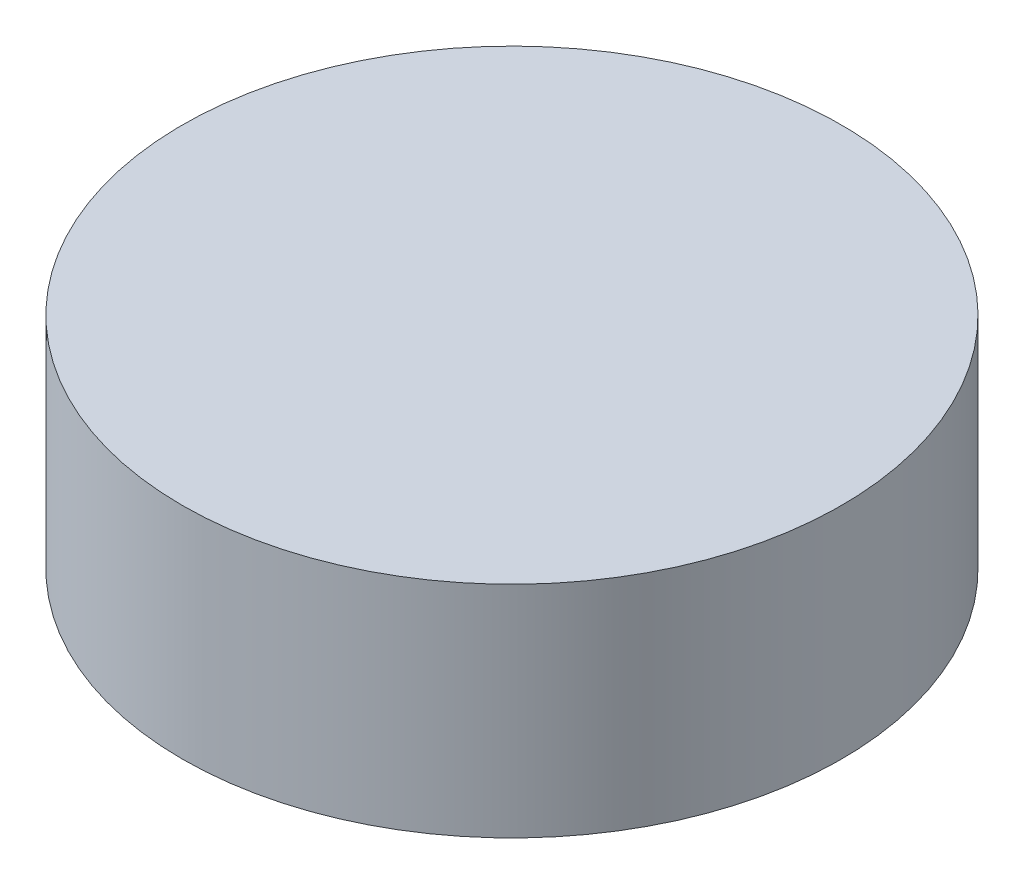
ISO-10303-21;
HEADER;
FILE_DESCRIPTION(('STEP AP214'),'2;1');
FILE_NAME('part.step','',(''),(''),'','','');
FILE_SCHEMA(('AUTOMOTIVE_DESIGN { 1 0 10303 214 1 1 1 1 }'));
ENDSEC;
DATA;
#1=APPLICATION_CONTEXT('core data for automotive mechanical design processes');
#2=APPLICATION_PROTOCOL_DEFINITION('international standard','automotive_design',2000,#1);
#3=PRODUCT_CONTEXT('',#1,'mechanical');
#4=PRODUCT('Part','Part','',(#3));
#5=PRODUCT_RELATED_PRODUCT_CATEGORY('part','',(#4));
#6=PRODUCT_DEFINITION_FORMATION('','',#4);
#7=PRODUCT_DEFINITION_CONTEXT('part definition',#1,'design');
#8=PRODUCT_DEFINITION('design','',#6,#7);
#9=PRODUCT_DEFINITION_SHAPE('','',#8);
#10=(LENGTH_UNIT() NAMED_UNIT(*) SI_UNIT(.MILLI.,.METRE.));
#11=(NAMED_UNIT(*) PLANE_ANGLE_UNIT() SI_UNIT($,.RADIAN.));
#12=(NAMED_UNIT(*) SI_UNIT($,.STERADIAN.) SOLID_ANGLE_UNIT());
#13=UNCERTAINTY_MEASURE_WITH_UNIT(LENGTH_MEASURE(1.E-05),#10,'distance_accuracy_value','');
#14=(GEOMETRIC_REPRESENTATION_CONTEXT(3) GLOBAL_UNCERTAINTY_ASSIGNED_CONTEXT((#13)) GLOBAL_UNIT_ASSIGNED_CONTEXT((#10,
#11,#12)) REPRESENTATION_CONTEXT('',''));
#15=CARTESIAN_POINT('',(0.,0.,0.));
#16=DIRECTION('',(0.,0.,1.));
#17=DIRECTION('',(1.,0.,0.));
#18=AXIS2_PLACEMENT_3D('',#15,#16,#17);
#19=CARTESIAN_POINT('',(0.,20.,0.));
#20=DIRECTION('',(0.,-1.,0.));
#21=DIRECTION('',(0.,0.,-1.));
#22=AXIS2_PLACEMENT_3D('',#19,#20,#21);
#23=CYLINDRICAL_SURFACE('',#22,30.);
#24=CARTESIAN_POINT('',(0.,20.,0.));
#25=DIRECTION('',(0.,1.,0.));
#26=DIRECTION('',(0.,0.,1.));
#27=AXIS2_PLACEMENT_3D('',#24,#25,#26);
#28=CIRCLE('',#27,30.);
#29=CARTESIAN_POINT('',(0.,20.,30.));
#30=VERTEX_POINT('',#29);
#31=EDGE_CURVE('E10',#30,#30,#28,.T.);
#32=ORIENTED_EDGE('',*,*,#31,.F.);
#33=EDGE_LOOP('',(#32));
#34=FACE_BOUND('',#33,.T.);
#35=CARTESIAN_POINT('',(0.,0.,0.));
#36=DIRECTION('',(0.,1.,0.));
#37=DIRECTION('',(0.,0.,1.));
#38=AXIS2_PLACEMENT_3D('',#35,#36,#37);
#39=CIRCLE('',#38,30.);
#40=CARTESIAN_POINT('',(0.,0.,30.));
#41=VERTEX_POINT('',#40);
#42=EDGE_CURVE('E34',#41,#41,#39,.T.);
#43=ORIENTED_EDGE('',*,*,#42,.T.);
#44=EDGE_LOOP('',(#43));
#45=FACE_BOUND('',#44,.T.);
#46=ADVANCED_FACE('F31',(#34,#45),#23,.T.);
#47=CARTESIAN_POINT('',(0.,20.,0.));
#48=DIRECTION('',(0.,1.,0.));
#49=DIRECTION('',(0.,0.,1.));
#50=AXIS2_PLACEMENT_3D('',#47,#48,#49);
#51=PLANE('',#50);
#52=ORIENTED_EDGE('',*,*,#31,.T.);
#53=EDGE_LOOP('',(#52));
#54=FACE_BOUND('',#53,.T.);
#55=ADVANCED_FACE('F46',(#54),#51,.T.);
#56=CARTESIAN_POINT('',(0.,0.,0.));
#57=DIRECTION('',(0.,1.,0.));
#58=DIRECTION('',(0.,0.,1.));
#59=AXIS2_PLACEMENT_3D('',#56,#57,#58);
#60=PLANE('',#59);
#61=ORIENTED_EDGE('',*,*,#42,.F.);
#62=EDGE_LOOP('',(#61));
#63=FACE_BOUND('',#62,.T.);
#64=ADVANCED_FACE('F44',(#63),#60,.F.);
#65=CLOSED_SHELL('',(#46,#55,#64));
#66=MANIFOLD_SOLID_BREP('B2',#65);
#67=ADVANCED_BREP_SHAPE_REPRESENTATION('',(#18,#66),#14);
#68=SHAPE_DEFINITION_REPRESENTATION(#9,#67);
ENDSEC;
END-ISO-10303-21;
